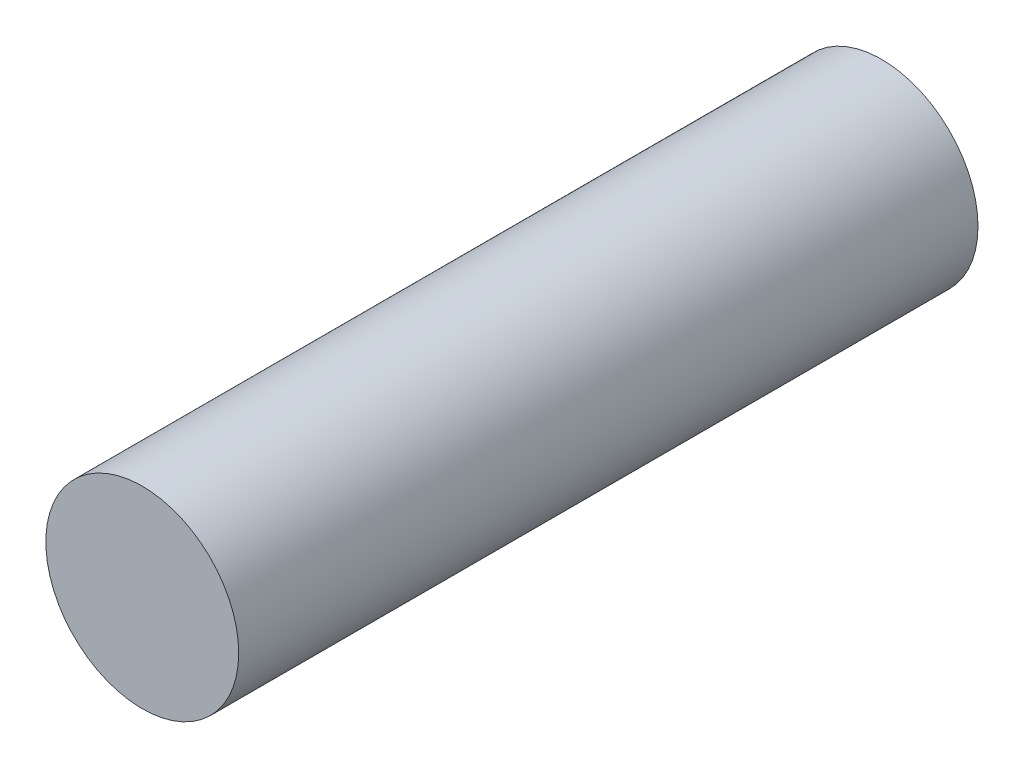
ISO-10303-21;
HEADER;
FILE_DESCRIPTION(('STEP AP214'),'2;1');
FILE_NAME('part.step','',(''),(''),'','','');
FILE_SCHEMA(('AUTOMOTIVE_DESIGN { 1 0 10303 214 1 1 1 1 }'));
ENDSEC;
DATA;
#1=APPLICATION_CONTEXT('core data for automotive mechanical design processes');
#2=APPLICATION_PROTOCOL_DEFINITION('international standard','automotive_design',2000,#1);
#3=PRODUCT_CONTEXT('',#1,'mechanical');
#4=PRODUCT('Part','Part','',(#3));
#5=PRODUCT_RELATED_PRODUCT_CATEGORY('part','',(#4));
#6=PRODUCT_DEFINITION_FORMATION('','',#4);
#7=PRODUCT_DEFINITION_CONTEXT('part definition',#1,'design');
#8=PRODUCT_DEFINITION('design','',#6,#7);
#9=PRODUCT_DEFINITION_SHAPE('','',#8);
#10=(LENGTH_UNIT() NAMED_UNIT(*) SI_UNIT(.MILLI.,.METRE.));
#11=(NAMED_UNIT(*) PLANE_ANGLE_UNIT() SI_UNIT($,.RADIAN.));
#12=(NAMED_UNIT(*) SI_UNIT($,.STERADIAN.) SOLID_ANGLE_UNIT());
#13=UNCERTAINTY_MEASURE_WITH_UNIT(LENGTH_MEASURE(1.E-05),#10,'distance_accuracy_value','');
#14=(GEOMETRIC_REPRESENTATION_CONTEXT(3) GLOBAL_UNCERTAINTY_ASSIGNED_CONTEXT((#13)) GLOBAL_UNIT_ASSIGNED_CONTEXT((#10,
#11,#12)) REPRESENTATION_CONTEXT('',''));
#15=CARTESIAN_POINT('',(0.,0.,0.));
#16=DIRECTION('',(0.,0.,1.));
#17=DIRECTION('',(1.,0.,0.));
#18=AXIS2_PLACEMENT_3D('',#15,#16,#17);
#19=CARTESIAN_POINT('',(0.,0.,11.5));
#20=DIRECTION('',(0.,0.,-1.));
#21=DIRECTION('',(-1.,0.,0.));
#22=AXIS2_PLACEMENT_3D('',#19,#20,#21);
#23=CYLINDRICAL_SURFACE('',#22,1.5);
#24=CARTESIAN_POINT('',(0.,0.,11.5));
#25=DIRECTION('',(0.,0.,1.));
#26=DIRECTION('',(1.,0.,0.));
#27=AXIS2_PLACEMENT_3D('',#24,#25,#26);
#28=CIRCLE('',#27,1.5);
#29=CARTESIAN_POINT('',(1.5,0.,11.5));
#30=VERTEX_POINT('',#29);
#31=EDGE_CURVE('E10',#30,#30,#28,.T.);
#32=ORIENTED_EDGE('',*,*,#31,.F.);
#33=EDGE_LOOP('',(#32));
#34=FACE_BOUND('',#33,.T.);
#35=CARTESIAN_POINT('',(0.,0.,0.));
#36=DIRECTION('',(0.,0.,1.));
#37=DIRECTION('',(1.,0.,0.));
#38=AXIS2_PLACEMENT_3D('',#35,#36,#37);
#39=CIRCLE('',#38,1.5);
#40=CARTESIAN_POINT('',(1.5,0.,0.));
#41=VERTEX_POINT('',#40);
#42=EDGE_CURVE('E37',#41,#41,#39,.T.);
#43=ORIENTED_EDGE('',*,*,#42,.T.);
#44=EDGE_LOOP('',(#43));
#45=FACE_BOUND('',#44,.T.);
#46=ADVANCED_FACE('F31',(#34,#45),#23,.T.);
#47=CARTESIAN_POINT('',(0.,0.,11.5));
#48=DIRECTION('',(0.,0.,1.));
#49=DIRECTION('',(1.,0.,0.));
#50=AXIS2_PLACEMENT_3D('',#47,#48,#49);
#51=PLANE('',#50);
#52=ORIENTED_EDGE('',*,*,#31,.T.);
#53=EDGE_LOOP('',(#52));
#54=FACE_BOUND('',#53,.T.);
#55=ADVANCED_FACE('F46',(#54),#51,.T.);
#56=CARTESIAN_POINT('',(0.,0.,0.));
#57=DIRECTION('',(0.,0.,1.));
#58=DIRECTION('',(1.,0.,0.));
#59=AXIS2_PLACEMENT_3D('',#56,#57,#58);
#60=PLANE('',#59);
#61=ORIENTED_EDGE('',*,*,#42,.F.);
#62=EDGE_LOOP('',(#61));
#63=FACE_BOUND('',#62,.T.);
#64=ADVANCED_FACE('F44',(#63),#60,.F.);
#65=CLOSED_SHELL('',(#46,#55,#64));
#66=MANIFOLD_SOLID_BREP('B2',#65);
#67=ADVANCED_BREP_SHAPE_REPRESENTATION('',(#18,#66),#14);
#68=SHAPE_DEFINITION_REPRESENTATION(#9,#67);
ENDSEC;
END-ISO-10303-21;
